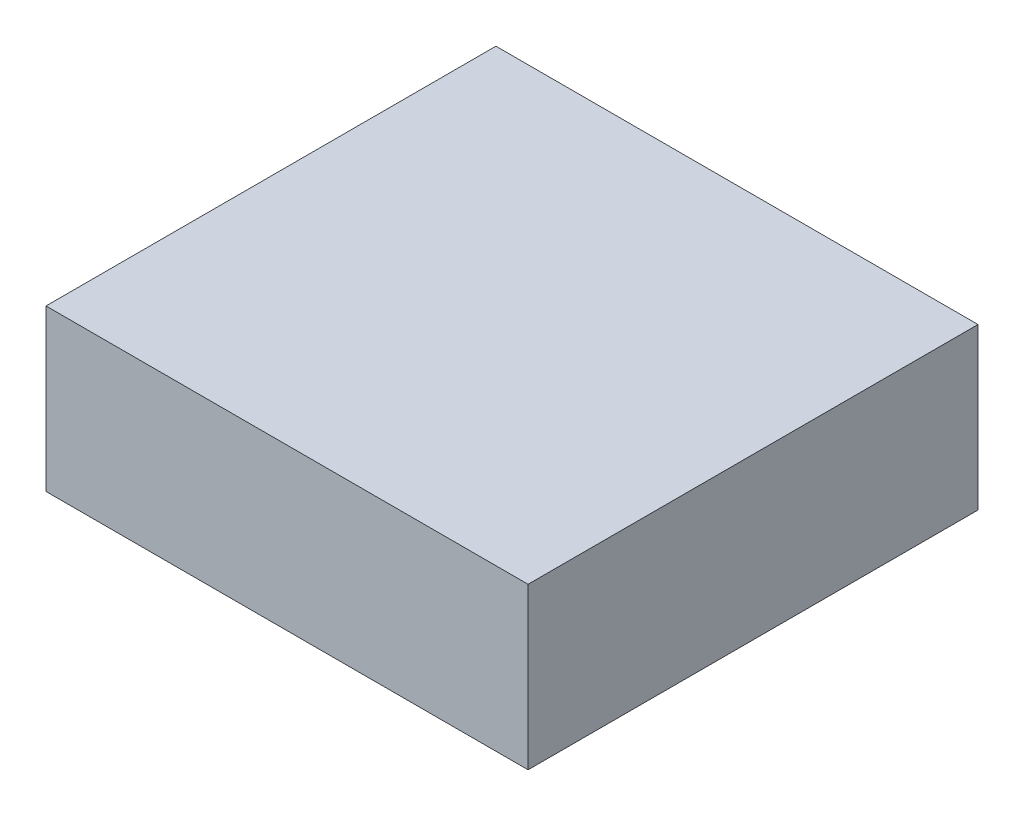
ISO-10303-21;
HEADER;
FILE_DESCRIPTION(('STEP AP214'),'2;1');
FILE_NAME('part.step','',(''),(''),'','','');
FILE_SCHEMA(('AUTOMOTIVE_DESIGN { 1 0 10303 214 1 1 1 1 }'));
ENDSEC;
DATA;
#1=APPLICATION_CONTEXT('core data for automotive mechanical design processes');
#2=APPLICATION_PROTOCOL_DEFINITION('international standard','automotive_design',2000,#1);
#3=PRODUCT_CONTEXT('',#1,'mechanical');
#4=PRODUCT('Part','Part','',(#3));
#5=PRODUCT_RELATED_PRODUCT_CATEGORY('part','',(#4));
#6=PRODUCT_DEFINITION_FORMATION('','',#4);
#7=PRODUCT_DEFINITION_CONTEXT('part definition',#1,'design');
#8=PRODUCT_DEFINITION('design','',#6,#7);
#9=PRODUCT_DEFINITION_SHAPE('','',#8);
#10=(LENGTH_UNIT() NAMED_UNIT(*) SI_UNIT(.MILLI.,.METRE.));
#11=(NAMED_UNIT(*) PLANE_ANGLE_UNIT() SI_UNIT($,.RADIAN.));
#12=(NAMED_UNIT(*) SI_UNIT($,.STERADIAN.) SOLID_ANGLE_UNIT());
#13=UNCERTAINTY_MEASURE_WITH_UNIT(LENGTH_MEASURE(1.E-05),#10,'distance_accuracy_value','');
#14=(GEOMETRIC_REPRESENTATION_CONTEXT(3) GLOBAL_UNCERTAINTY_ASSIGNED_CONTEXT((#13)) GLOBAL_UNIT_ASSIGNED_CONTEXT((#10,
#11,#12)) REPRESENTATION_CONTEXT('',''));
#15=CARTESIAN_POINT('',(0.,0.,0.));
#16=DIRECTION('',(0.,0.,1.));
#17=DIRECTION('',(1.,0.,0.));
#18=AXIS2_PLACEMENT_3D('',#15,#16,#17);
#19=CARTESIAN_POINT('',(-30.,20.,28.));
#20=DIRECTION('',(1.,0.,0.));
#21=DIRECTION('',(0.,0.,-1.));
#22=AXIS2_PLACEMENT_3D('',#19,#20,#21);
#23=PLANE('',#22);
#24=DIRECTION('',(0.,0.,1.));
#25=VECTOR('',#24,1.);
#26=CARTESIAN_POINT('',(-30.,0.,28.));
#27=LINE('',#26,#25);
#28=CARTESIAN_POINT('',(-30.,0.,-28.));
#29=VERTEX_POINT('',#28);
#30=CARTESIAN_POINT('',(-30.,0.,28.));
#31=VERTEX_POINT('',#30);
#32=EDGE_CURVE('E96',#29,#31,#27,.T.);
#33=ORIENTED_EDGE('',*,*,#32,.T.);
#34=DIRECTION('',(0.,-1.,0.));
#35=VECTOR('',#34,1.);
#36=CARTESIAN_POINT('',(-30.,20.,28.));
#37=LINE('',#36,#35);
#38=CARTESIAN_POINT('',(-30.,20.,28.));
#39=VERTEX_POINT('',#38);
#40=EDGE_CURVE('E11',#39,#31,#37,.T.);
#41=ORIENTED_EDGE('',*,*,#40,.F.);
#42=DIRECTION('',(0.,0.,1.));
#43=VECTOR('',#42,1.);
#44=CARTESIAN_POINT('',(-30.,20.,28.));
#45=LINE('',#44,#43);
#46=CARTESIAN_POINT('',(-30.,20.,-28.));
#47=VERTEX_POINT('',#46);
#48=EDGE_CURVE('E84',#47,#39,#45,.T.);
#49=ORIENTED_EDGE('',*,*,#48,.F.);
#50=DIRECTION('',(0.,-1.,0.));
#51=VECTOR('',#50,1.);
#52=CARTESIAN_POINT('',(-30.,20.,-28.));
#53=LINE('',#52,#51);
#54=EDGE_CURVE('E92',#47,#29,#53,.T.);
#55=ORIENTED_EDGE('',*,*,#54,.T.);
#56=EDGE_LOOP('',(#33,#41,#49,#55));
#57=FACE_BOUND('',#56,.T.);
#58=ADVANCED_FACE('F33',(#57),#23,.F.);
#59=CARTESIAN_POINT('',(30.,20.,28.));
#60=DIRECTION('',(0.,0.,-1.));
#61=DIRECTION('',(-1.,0.,0.));
#62=AXIS2_PLACEMENT_3D('',#59,#60,#61);
#63=PLANE('',#62);
#64=DIRECTION('',(1.,0.,0.));
#65=VECTOR('',#64,1.);
#66=CARTESIAN_POINT('',(30.,0.,28.));
#67=LINE('',#66,#65);
#68=CARTESIAN_POINT('',(30.,0.,28.));
#69=VERTEX_POINT('',#68);
#70=EDGE_CURVE('E88',#31,#69,#67,.T.);
#71=ORIENTED_EDGE('',*,*,#70,.T.);
#72=DIRECTION('',(0.,-1.,0.));
#73=VECTOR('',#72,1.);
#74=CARTESIAN_POINT('',(30.,20.,28.));
#75=LINE('',#74,#73);
#76=CARTESIAN_POINT('',(30.,20.,28.));
#77=VERTEX_POINT('',#76);
#78=EDGE_CURVE('E41',#77,#69,#75,.T.);
#79=ORIENTED_EDGE('',*,*,#78,.F.);
#80=DIRECTION('',(1.,0.,0.));
#81=VECTOR('',#80,1.);
#82=CARTESIAN_POINT('',(30.,20.,28.));
#83=LINE('',#82,#81);
#84=EDGE_CURVE('E79',#39,#77,#83,.T.);
#85=ORIENTED_EDGE('',*,*,#84,.F.);
#86=ORIENTED_EDGE('',*,*,#40,.T.);
#87=EDGE_LOOP('',(#71,#79,#85,#86));
#88=FACE_BOUND('',#87,.T.);
#89=ADVANCED_FACE('F87',(#88),#63,.F.);
#90=CARTESIAN_POINT('',(30.,20.,28.));
#91=DIRECTION('',(-1.,0.,0.));
#92=DIRECTION('',(0.,0.,1.));
#93=AXIS2_PLACEMENT_3D('',#90,#91,#92);
#94=PLANE('',#93);
#95=DIRECTION('',(0.,0.,-1.));
#96=VECTOR('',#95,1.);
#97=CARTESIAN_POINT('',(30.,0.,28.));
#98=LINE('',#97,#96);
#99=CARTESIAN_POINT('',(30.,0.,-28.));
#100=VERTEX_POINT('',#99);
#101=EDGE_CURVE('E66',#69,#100,#98,.T.);
#102=ORIENTED_EDGE('',*,*,#101,.T.);
#103=DIRECTION('',(0.,-1.,0.));
#104=VECTOR('',#103,1.);
#105=CARTESIAN_POINT('',(30.,20.,-28.));
#106=LINE('',#105,#104);
#107=CARTESIAN_POINT('',(30.,20.,-28.));
#108=VERTEX_POINT('',#107);
#109=EDGE_CURVE('E89',#108,#100,#106,.T.);
#110=ORIENTED_EDGE('',*,*,#109,.F.);
#111=DIRECTION('',(0.,0.,-1.));
#112=VECTOR('',#111,1.);
#113=CARTESIAN_POINT('',(30.,20.,28.));
#114=LINE('',#113,#112);
#115=EDGE_CURVE('E82',#77,#108,#114,.T.);
#116=ORIENTED_EDGE('',*,*,#115,.F.);
#117=ORIENTED_EDGE('',*,*,#78,.T.);
#118=EDGE_LOOP('',(#102,#110,#116,#117));
#119=FACE_BOUND('',#118,.T.);
#120=ADVANCED_FACE('F90',(#119),#94,.F.);
#121=CARTESIAN_POINT('',(30.,20.,-28.));
#122=DIRECTION('',(0.,0.,1.));
#123=DIRECTION('',(1.,0.,0.));
#124=AXIS2_PLACEMENT_3D('',#121,#122,#123);
#125=PLANE('',#124);
#126=DIRECTION('',(-1.,0.,0.));
#127=VECTOR('',#126,1.);
#128=CARTESIAN_POINT('',(30.,0.,-28.));
#129=LINE('',#128,#127);
#130=EDGE_CURVE('E72',#100,#29,#129,.T.);
#131=ORIENTED_EDGE('',*,*,#130,.T.);
#132=ORIENTED_EDGE('',*,*,#54,.F.);
#133=DIRECTION('',(-1.,0.,0.));
#134=VECTOR('',#133,1.);
#135=CARTESIAN_POINT('',(30.,20.,-28.));
#136=LINE('',#135,#134);
#137=EDGE_CURVE('E49',#108,#47,#136,.T.);
#138=ORIENTED_EDGE('',*,*,#137,.F.);
#139=ORIENTED_EDGE('',*,*,#109,.T.);
#140=EDGE_LOOP('',(#131,#132,#138,#139));
#141=FACE_BOUND('',#140,.T.);
#142=ADVANCED_FACE('F103',(#141),#125,.F.);
#143=CARTESIAN_POINT('',(0.,20.,0.));
#144=DIRECTION('',(0.,1.,0.));
#145=DIRECTION('',(0.,0.,1.));
#146=AXIS2_PLACEMENT_3D('',#143,#144,#145);
#147=PLANE('',#146);
#148=ORIENTED_EDGE('',*,*,#48,.T.);
#149=ORIENTED_EDGE('',*,*,#84,.T.);
#150=ORIENTED_EDGE('',*,*,#115,.T.);
#151=ORIENTED_EDGE('',*,*,#137,.T.);
#152=EDGE_LOOP('',(#148,#149,#150,#151));
#153=FACE_BOUND('',#152,.T.);
#154=ADVANCED_FACE('F80',(#153),#147,.T.);
#155=CARTESIAN_POINT('',(0.,0.,0.));
#156=DIRECTION('',(0.,1.,0.));
#157=DIRECTION('',(0.,0.,1.));
#158=AXIS2_PLACEMENT_3D('',#155,#156,#157);
#159=PLANE('',#158);
#160=ORIENTED_EDGE('',*,*,#32,.F.);
#161=ORIENTED_EDGE('',*,*,#130,.F.);
#162=ORIENTED_EDGE('',*,*,#101,.F.);
#163=ORIENTED_EDGE('',*,*,#70,.F.);
#164=EDGE_LOOP('',(#160,#161,#162,#163));
#165=FACE_BOUND('',#164,.T.);
#166=ADVANCED_FACE('F106',(#165),#159,.F.);
#167=CLOSED_SHELL('',(#58,#89,#120,#142,#154,#166));
#168=MANIFOLD_SOLID_BREP('B2',#167);
#169=ADVANCED_BREP_SHAPE_REPRESENTATION('',(#18,#168),#14);
#170=SHAPE_DEFINITION_REPRESENTATION(#9,#169);
ENDSEC;
END-ISO-10303-21;
